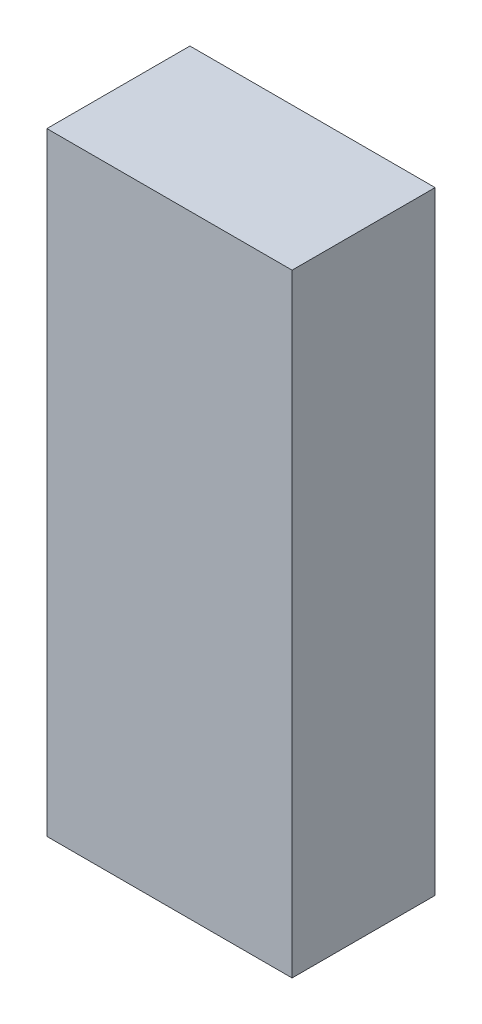
ISO-10303-21;
HEADER;
FILE_DESCRIPTION(('STEP AP214'),'2;1');
FILE_NAME('part.step','',(''),(''),'','','');
FILE_SCHEMA(('AUTOMOTIVE_DESIGN { 1 0 10303 214 1 1 1 1 }'));
ENDSEC;
DATA;
#1=APPLICATION_CONTEXT('core data for automotive mechanical design processes');
#2=APPLICATION_PROTOCOL_DEFINITION('international standard','automotive_design',2000,#1);
#3=PRODUCT_CONTEXT('',#1,'mechanical');
#4=PRODUCT('Part','Part','',(#3));
#5=PRODUCT_RELATED_PRODUCT_CATEGORY('part','',(#4));
#6=PRODUCT_DEFINITION_FORMATION('','',#4);
#7=PRODUCT_DEFINITION_CONTEXT('part definition',#1,'design');
#8=PRODUCT_DEFINITION('design','',#6,#7);
#9=PRODUCT_DEFINITION_SHAPE('','',#8);
#10=(LENGTH_UNIT() NAMED_UNIT(*) SI_UNIT(.MILLI.,.METRE.));
#11=(NAMED_UNIT(*) PLANE_ANGLE_UNIT() SI_UNIT($,.RADIAN.));
#12=(NAMED_UNIT(*) SI_UNIT($,.STERADIAN.) SOLID_ANGLE_UNIT());
#13=UNCERTAINTY_MEASURE_WITH_UNIT(LENGTH_MEASURE(1.E-05),#10,'distance_accuracy_value','');
#14=(GEOMETRIC_REPRESENTATION_CONTEXT(3) GLOBAL_UNCERTAINTY_ASSIGNED_CONTEXT((#13)) GLOBAL_UNIT_ASSIGNED_CONTEXT((#10,
#11,#12)) REPRESENTATION_CONTEXT('',''));
#15=CARTESIAN_POINT('',(0.,0.,0.));
#16=DIRECTION('',(0.,0.,1.));
#17=DIRECTION('',(1.,0.,0.));
#18=AXIS2_PLACEMENT_3D('',#15,#16,#17);
#19=CARTESIAN_POINT('',(1.524,3.81,1.778));
#20=DIRECTION('',(0.,0.,1.));
#21=DIRECTION('',(1.,0.,0.));
#22=AXIS2_PLACEMENT_3D('',#19,#20,#21);
#23=PLANE('',#22);
#24=DIRECTION('',(1.,0.,0.));
#25=VECTOR('',#24,1.);
#26=CARTESIAN_POINT('',(1.524,-3.81,1.778));
#27=LINE('',#26,#25);
#28=CARTESIAN_POINT('',(1.524,-3.81,1.778));
#29=VERTEX_POINT('',#28);
#30=CARTESIAN_POINT('',(-1.524,-3.81,1.778));
#31=VERTEX_POINT('',#30);
#32=EDGE_CURVE('E52',#29,#31,#27,.F.);
#33=ORIENTED_EDGE('',*,*,#32,.F.);
#34=DIRECTION('',(0.,1.,0.));
#35=VECTOR('',#34,1.);
#36=CARTESIAN_POINT('',(1.524,3.81,1.778));
#37=LINE('',#36,#35);
#38=CARTESIAN_POINT('',(1.524,3.81,1.778));
#39=VERTEX_POINT('',#38);
#40=EDGE_CURVE('E67',#39,#29,#37,.F.);
#41=ORIENTED_EDGE('',*,*,#40,.F.);
#42=DIRECTION('',(1.,0.,0.));
#43=VECTOR('',#42,1.);
#44=CARTESIAN_POINT('',(-1.524,3.81,1.778));
#45=LINE('',#44,#43);
#46=CARTESIAN_POINT('',(-1.524,3.81,1.778));
#47=VERTEX_POINT('',#46);
#48=EDGE_CURVE('E19',#47,#39,#45,.T.);
#49=ORIENTED_EDGE('',*,*,#48,.F.);
#50=DIRECTION('',(0.,1.,0.));
#51=VECTOR('',#50,1.);
#52=CARTESIAN_POINT('',(-1.524,-3.81,1.778));
#53=LINE('',#52,#51);
#54=EDGE_CURVE('E57',#31,#47,#53,.T.);
#55=ORIENTED_EDGE('',*,*,#54,.F.);
#56=EDGE_LOOP('',(#33,#41,#49,#55));
#57=FACE_BOUND('',#56,.T.);
#58=ADVANCED_FACE('F16',(#57),#23,.T.);
#59=CARTESIAN_POINT('',(-1.524,3.81,0.));
#60=DIRECTION('',(0.,1.,0.));
#61=DIRECTION('',(0.,0.,1.));
#62=AXIS2_PLACEMENT_3D('',#59,#60,#61);
#63=PLANE('',#62);
#64=DIRECTION('',(0.,0.,-1.));
#65=VECTOR('',#64,1.);
#66=CARTESIAN_POINT('',(1.524,3.81,0.));
#67=LINE('',#66,#65);
#68=CARTESIAN_POINT('',(1.524,3.81,0.));
#69=VERTEX_POINT('',#68);
#70=EDGE_CURVE('E78',#69,#39,#67,.F.);
#71=ORIENTED_EDGE('',*,*,#70,.F.);
#72=DIRECTION('',(1.,0.,0.));
#73=VECTOR('',#72,1.);
#74=CARTESIAN_POINT('',(1.524,3.81,0.));
#75=LINE('',#74,#73);
#76=CARTESIAN_POINT('',(-1.524,3.81,0.));
#77=VERTEX_POINT('',#76);
#78=EDGE_CURVE('E73',#69,#77,#75,.F.);
#79=ORIENTED_EDGE('',*,*,#78,.T.);
#80=DIRECTION('',(0.,0.,1.));
#81=VECTOR('',#80,1.);
#82=CARTESIAN_POINT('',(-1.524,3.81,0.));
#83=LINE('',#82,#81);
#84=EDGE_CURVE('E62',#47,#77,#83,.F.);
#85=ORIENTED_EDGE('',*,*,#84,.F.);
#86=ORIENTED_EDGE('',*,*,#48,.T.);
#87=EDGE_LOOP('',(#71,#79,#85,#86));
#88=FACE_BOUND('',#87,.T.);
#89=ADVANCED_FACE('F72',(#88),#63,.T.);
#90=CARTESIAN_POINT('',(-1.524,-3.81,0.));
#91=DIRECTION('',(-1.,0.,0.));
#92=DIRECTION('',(0.,0.,1.));
#93=AXIS2_PLACEMENT_3D('',#90,#91,#92);
#94=PLANE('',#93);
#95=ORIENTED_EDGE('',*,*,#84,.T.);
#96=DIRECTION('',(0.,1.,0.));
#97=VECTOR('',#96,1.);
#98=CARTESIAN_POINT('',(-1.524,3.81,0.));
#99=LINE('',#98,#97);
#100=CARTESIAN_POINT('',(-1.524,-3.81,0.));
#101=VERTEX_POINT('',#100);
#102=EDGE_CURVE('E83',#77,#101,#99,.F.);
#103=ORIENTED_EDGE('',*,*,#102,.T.);
#104=DIRECTION('',(0.,0.,-1.));
#105=VECTOR('',#104,1.);
#106=CARTESIAN_POINT('',(-1.524,-3.81,0.));
#107=LINE('',#106,#105);
#108=EDGE_CURVE('E64',#31,#101,#107,.T.);
#109=ORIENTED_EDGE('',*,*,#108,.F.);
#110=ORIENTED_EDGE('',*,*,#54,.T.);
#111=EDGE_LOOP('',(#95,#103,#109,#110));
#112=FACE_BOUND('',#111,.T.);
#113=ADVANCED_FACE('F59',(#112),#94,.T.);
#114=CARTESIAN_POINT('',(1.524,-3.81,0.));
#115=DIRECTION('',(0.,-1.,0.));
#116=DIRECTION('',(0.,0.,-1.));
#117=AXIS2_PLACEMENT_3D('',#114,#115,#116);
#118=PLANE('',#117);
#119=ORIENTED_EDGE('',*,*,#108,.T.);
#120=DIRECTION('',(1.,0.,0.));
#121=VECTOR('',#120,1.);
#122=CARTESIAN_POINT('',(1.524,-3.81,0.));
#123=LINE('',#122,#121);
#124=CARTESIAN_POINT('',(1.524,-3.81,0.));
#125=VERTEX_POINT('',#124);
#126=EDGE_CURVE('E25',#101,#125,#123,.T.);
#127=ORIENTED_EDGE('',*,*,#126,.T.);
#128=DIRECTION('',(0.,0.,-1.));
#129=VECTOR('',#128,1.);
#130=CARTESIAN_POINT('',(1.524,-3.81,0.));
#131=LINE('',#130,#129);
#132=EDGE_CURVE('E33',#29,#125,#131,.T.);
#133=ORIENTED_EDGE('',*,*,#132,.F.);
#134=ORIENTED_EDGE('',*,*,#32,.T.);
#135=EDGE_LOOP('',(#119,#127,#133,#134));
#136=FACE_BOUND('',#135,.T.);
#137=ADVANCED_FACE('F87',(#136),#118,.T.);
#138=CARTESIAN_POINT('',(1.524,3.81,0.));
#139=DIRECTION('',(1.,0.,0.));
#140=DIRECTION('',(0.,0.,-1.));
#141=AXIS2_PLACEMENT_3D('',#138,#139,#140);
#142=PLANE('',#141);
#143=ORIENTED_EDGE('',*,*,#132,.T.);
#144=DIRECTION('',(0.,1.,0.));
#145=VECTOR('',#144,1.);
#146=CARTESIAN_POINT('',(1.524,3.81,0.));
#147=LINE('',#146,#145);
#148=EDGE_CURVE('E10',#125,#69,#147,.T.);
#149=ORIENTED_EDGE('',*,*,#148,.T.);
#150=ORIENTED_EDGE('',*,*,#70,.T.);
#151=ORIENTED_EDGE('',*,*,#40,.T.);
#152=EDGE_LOOP('',(#143,#149,#150,#151));
#153=FACE_BOUND('',#152,.T.);
#154=ADVANCED_FACE('F90',(#153),#142,.T.);
#155=CARTESIAN_POINT('',(1.524,3.81,0.));
#156=DIRECTION('',(0.,0.,1.));
#157=DIRECTION('',(1.,0.,0.));
#158=AXIS2_PLACEMENT_3D('',#155,#156,#157);
#159=PLANE('',#158);
#160=ORIENTED_EDGE('',*,*,#126,.F.);
#161=ORIENTED_EDGE('',*,*,#102,.F.);
#162=ORIENTED_EDGE('',*,*,#78,.F.);
#163=ORIENTED_EDGE('',*,*,#148,.F.);
#164=EDGE_LOOP('',(#160,#161,#162,#163));
#165=FACE_BOUND('',#164,.T.);
#166=ADVANCED_FACE('F89',(#165),#159,.F.);
#167=CLOSED_SHELL('',(#58,#89,#113,#137,#154,#166));
#168=MANIFOLD_SOLID_BREP('B1',#167);
#169=ADVANCED_BREP_SHAPE_REPRESENTATION('',(#18,#168),#14);
#170=SHAPE_DEFINITION_REPRESENTATION(#9,#169);
ENDSEC;
END-ISO-10303-21;
